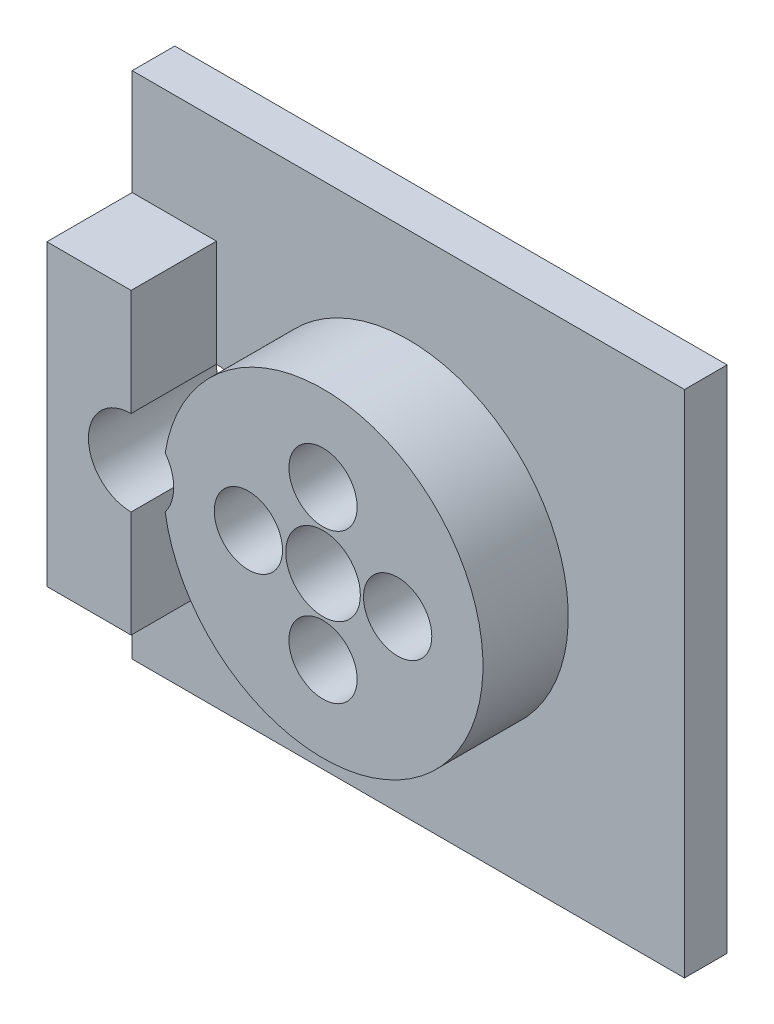
ISO-10303-21;
HEADER;
FILE_DESCRIPTION(('STEP AP214'),'2;1');
FILE_NAME('part.step','',(''),(''),'','','');
FILE_SCHEMA(('AUTOMOTIVE_DESIGN { 1 0 10303 214 1 1 1 1 }'));
ENDSEC;
DATA;
#1=APPLICATION_CONTEXT('core data for automotive mechanical design processes');
#2=APPLICATION_PROTOCOL_DEFINITION('international standard','automotive_design',2000,#1);
#3=PRODUCT_CONTEXT('',#1,'mechanical');
#4=PRODUCT('Part','Part','',(#3));
#5=PRODUCT_RELATED_PRODUCT_CATEGORY('part','',(#4));
#6=PRODUCT_DEFINITION_FORMATION('','',#4);
#7=PRODUCT_DEFINITION_CONTEXT('part definition',#1,'design');
#8=PRODUCT_DEFINITION('design','',#6,#7);
#9=PRODUCT_DEFINITION_SHAPE('','',#8);
#10=(LENGTH_UNIT() NAMED_UNIT(*) SI_UNIT(.MILLI.,.METRE.));
#11=(NAMED_UNIT(*) PLANE_ANGLE_UNIT() SI_UNIT($,.RADIAN.));
#12=(NAMED_UNIT(*) SI_UNIT($,.STERADIAN.) SOLID_ANGLE_UNIT());
#13=UNCERTAINTY_MEASURE_WITH_UNIT(LENGTH_MEASURE(1.E-05),#10,'distance_accuracy_value','');
#14=(GEOMETRIC_REPRESENTATION_CONTEXT(3) GLOBAL_UNCERTAINTY_ASSIGNED_CONTEXT((#13)) GLOBAL_UNIT_ASSIGNED_CONTEXT((#10,
#11,#12)) REPRESENTATION_CONTEXT('',''));
#15=CARTESIAN_POINT('',(0.,0.,0.));
#16=DIRECTION('',(0.,0.,1.));
#17=DIRECTION('',(1.,0.,0.));
#18=AXIS2_PLACEMENT_3D('',#15,#16,#17);
#19=CARTESIAN_POINT('',(0.,-7.,12.1));
#20=DIRECTION('',(0.,0.,-1.));
#21=DIRECTION('',(-1.,0.,0.));
#22=AXIS2_PLACEMENT_3D('',#19,#20,#21);
#23=CYLINDRICAL_SURFACE('',#22,1.7);
#24=CARTESIAN_POINT('',(0.,-7.,0.));
#25=DIRECTION('',(0.,0.,1.));
#26=DIRECTION('',(1.,0.,0.));
#27=AXIS2_PLACEMENT_3D('',#24,#25,#26);
#28=CIRCLE('',#27,1.7);
#29=CARTESIAN_POINT('',(1.7,-7.,0.));
#30=VERTEX_POINT('',#29);
#31=EDGE_CURVE('E218',#30,#30,#28,.F.);
#32=ORIENTED_EDGE('',*,*,#31,.T.);
#33=EDGE_LOOP('',(#32));
#34=FACE_BOUND('',#33,.T.);
#35=CARTESIAN_POINT('',(0.,-7.,5.));
#36=DIRECTION('',(0.,0.,1.));
#37=DIRECTION('',(1.,0.,0.));
#38=AXIS2_PLACEMENT_3D('',#35,#36,#37);
#39=CIRCLE('',#38,1.7);
#40=CARTESIAN_POINT('',(1.7,-7.,5.));
#41=VERTEX_POINT('',#40);
#42=EDGE_CURVE('E234',#41,#41,#39,.T.);
#43=ORIENTED_EDGE('',*,*,#42,.T.);
#44=EDGE_LOOP('',(#43));
#45=FACE_BOUND('',#44,.T.);
#46=ADVANCED_FACE('F39',(#34,#45),#23,.F.);
#47=CARTESIAN_POINT('',(-7.,0.,12.1));
#48=DIRECTION('',(0.,0.,-1.));
#49=DIRECTION('',(-1.,0.,0.));
#50=AXIS2_PLACEMENT_3D('',#47,#48,#49);
#51=CYLINDRICAL_SURFACE('',#50,1.7);
#52=CARTESIAN_POINT('',(-7.,0.,0.));
#53=DIRECTION('',(0.,0.,1.));
#54=DIRECTION('',(1.,0.,0.));
#55=AXIS2_PLACEMENT_3D('',#52,#53,#54);
#56=CIRCLE('',#55,1.7);
#57=CARTESIAN_POINT('',(-5.3,0.,0.));
#58=VERTEX_POINT('',#57);
#59=EDGE_CURVE('E262',#58,#58,#56,.F.);
#60=ORIENTED_EDGE('',*,*,#59,.T.);
#61=EDGE_LOOP('',(#60));
#62=FACE_BOUND('',#61,.T.);
#63=CARTESIAN_POINT('',(-7.,0.,5.));
#64=DIRECTION('',(0.,0.,1.));
#65=DIRECTION('',(1.,0.,0.));
#66=AXIS2_PLACEMENT_3D('',#63,#64,#65);
#67=CIRCLE('',#66,1.7);
#68=CARTESIAN_POINT('',(-5.3,0.,5.));
#69=VERTEX_POINT('',#68);
#70=EDGE_CURVE('E227',#69,#69,#67,.T.);
#71=ORIENTED_EDGE('',*,*,#70,.T.);
#72=EDGE_LOOP('',(#71));
#73=FACE_BOUND('',#72,.T.);
#74=ADVANCED_FACE('F337',(#62,#73),#51,.F.);
#75=CARTESIAN_POINT('',(0.,7.,12.1));
#76=DIRECTION('',(0.,0.,-1.));
#77=DIRECTION('',(-1.,0.,0.));
#78=AXIS2_PLACEMENT_3D('',#75,#76,#77);
#79=CYLINDRICAL_SURFACE('',#78,1.7);
#80=CARTESIAN_POINT('',(0.,7.,0.));
#81=DIRECTION('',(0.,0.,1.));
#82=DIRECTION('',(1.,0.,0.));
#83=AXIS2_PLACEMENT_3D('',#80,#81,#82);
#84=CIRCLE('',#83,1.7);
#85=CARTESIAN_POINT('',(1.7,7.,0.));
#86=VERTEX_POINT('',#85);
#87=EDGE_CURVE('E266',#86,#86,#84,.F.);
#88=ORIENTED_EDGE('',*,*,#87,.T.);
#89=EDGE_LOOP('',(#88));
#90=FACE_BOUND('',#89,.T.);
#91=CARTESIAN_POINT('',(0.,7.,5.));
#92=DIRECTION('',(0.,0.,1.));
#93=DIRECTION('',(1.,0.,0.));
#94=AXIS2_PLACEMENT_3D('',#91,#92,#93);
#95=CIRCLE('',#94,1.7);
#96=CARTESIAN_POINT('',(1.7,7.,5.));
#97=VERTEX_POINT('',#96);
#98=EDGE_CURVE('E219',#97,#97,#95,.T.);
#99=ORIENTED_EDGE('',*,*,#98,.T.);
#100=EDGE_LOOP('',(#99));
#101=FACE_BOUND('',#100,.T.);
#102=ADVANCED_FACE('F341',(#90,#101),#79,.F.);
#103=CARTESIAN_POINT('',(7.,0.,12.1));
#104=DIRECTION('',(0.,0.,-1.));
#105=DIRECTION('',(-1.,0.,0.));
#106=AXIS2_PLACEMENT_3D('',#103,#104,#105);
#107=CYLINDRICAL_SURFACE('',#106,1.7);
#108=CARTESIAN_POINT('',(7.,0.,0.));
#109=DIRECTION('',(0.,0.,1.));
#110=DIRECTION('',(1.,0.,0.));
#111=AXIS2_PLACEMENT_3D('',#108,#109,#110);
#112=CIRCLE('',#111,1.7);
#113=CARTESIAN_POINT('',(8.7,0.,0.));
#114=VERTEX_POINT('',#113);
#115=EDGE_CURVE('E212',#114,#114,#112,.F.);
#116=ORIENTED_EDGE('',*,*,#115,.T.);
#117=EDGE_LOOP('',(#116));
#118=FACE_BOUND('',#117,.T.);
#119=CARTESIAN_POINT('',(7.,0.,5.));
#120=DIRECTION('',(0.,0.,1.));
#121=DIRECTION('',(1.,0.,0.));
#122=AXIS2_PLACEMENT_3D('',#119,#120,#121);
#123=CIRCLE('',#122,1.7);
#124=CARTESIAN_POINT('',(8.7,0.,5.));
#125=VERTEX_POINT('',#124);
#126=EDGE_CURVE('E215',#125,#125,#123,.T.);
#127=ORIENTED_EDGE('',*,*,#126,.T.);
#128=EDGE_LOOP('',(#127));
#129=FACE_BOUND('',#128,.T.);
#130=ADVANCED_FACE('F353',(#118,#129),#107,.F.);
#131=CARTESIAN_POINT('',(0.,0.,12.));
#132=DIRECTION('',(0.,0.,-1.));
#133=DIRECTION('',(-1.,0.,0.));
#134=AXIS2_PLACEMENT_3D('',#131,#132,#133);
#135=CYLINDRICAL_SURFACE('',#134,15.);
#136=DIRECTION('',(0.,0.,-1.));
#137=VECTOR('',#136,1.);
#138=CARTESIAN_POINT('',(-14.8055555555556,2.40738960107375,6.));
#139=LINE('',#138,#137);
#140=CARTESIAN_POINT('',(-14.8055555555556,2.40738960107375,12.));
#141=VERTEX_POINT('',#140);
#142=CARTESIAN_POINT('',(-14.8055555555556,2.40738960107375,4.));
#143=VERTEX_POINT('',#142);
#144=EDGE_CURVE('E278',#141,#143,#139,.T.);
#145=ORIENTED_EDGE('',*,*,#144,.F.);
#146=CARTESIAN_POINT('',(0.,0.,12.));
#147=DIRECTION('',(0.,0.,1.));
#148=DIRECTION('',(1.,0.,0.));
#149=AXIS2_PLACEMENT_3D('',#146,#147,#148);
#150=CIRCLE('',#149,15.);
#151=CARTESIAN_POINT('',(-14.8055555555556,-2.40738960107376,12.));
#152=VERTEX_POINT('',#151);
#153=EDGE_CURVE('E161',#152,#141,#150,.T.);
#154=ORIENTED_EDGE('',*,*,#153,.F.);
#155=DIRECTION('',(0.,0.,-1.));
#156=VECTOR('',#155,1.);
#157=CARTESIAN_POINT('',(-14.8055555555556,-2.40738960107375,6.));
#158=LINE('',#157,#156);
#159=CARTESIAN_POINT('',(-14.8055555555556,-2.40738960107375,4.));
#160=VERTEX_POINT('',#159);
#161=EDGE_CURVE('E279',#160,#152,#158,.F.);
#162=ORIENTED_EDGE('',*,*,#161,.F.);
#163=CARTESIAN_POINT('',(0.,0.,4.));
#164=DIRECTION('',(0.,0.,1.));
#165=DIRECTION('',(1.,0.,0.));
#166=AXIS2_PLACEMENT_3D('',#163,#164,#165);
#167=CIRCLE('',#166,15.);
#168=EDGE_CURVE('E168',#143,#160,#167,.F.);
#169=ORIENTED_EDGE('',*,*,#168,.F.);
#170=EDGE_LOOP('',(#145,#154,#162,#169));
#171=FACE_BOUND('',#170,.T.);
#172=ADVANCED_FACE('F304',(#171),#135,.T.);
#173=CARTESIAN_POINT('',(-18.,-14.,12.));
#174=DIRECTION('',(-1.,0.,0.));
#175=DIRECTION('',(0.,0.,1.));
#176=AXIS2_PLACEMENT_3D('',#173,#174,#175);
#177=PLANE('',#176);
#178=DIRECTION('',(0.,0.,-1.));
#179=VECTOR('',#178,1.);
#180=CARTESIAN_POINT('',(-18.,4.,12.1));
#181=LINE('',#180,#179);
#182=CARTESIAN_POINT('',(-18.,4.,4.));
#183=VERTEX_POINT('',#182);
#184=CARTESIAN_POINT('',(-18.,4.,12.));
#185=VERTEX_POINT('',#184);
#186=EDGE_CURVE('E57',#183,#185,#181,.F.);
#187=ORIENTED_EDGE('',*,*,#186,.F.);
#188=DIRECTION('',(0.,-1.,0.));
#189=VECTOR('',#188,1.);
#190=CARTESIAN_POINT('',(-18.,0.,4.));
#191=LINE('',#190,#189);
#192=CARTESIAN_POINT('',(-18.,14.,4.));
#193=VERTEX_POINT('',#192);
#194=EDGE_CURVE('E204',#193,#183,#191,.T.);
#195=ORIENTED_EDGE('',*,*,#194,.F.);
#196=DIRECTION('',(0.,0.,-1.));
#197=VECTOR('',#196,1.);
#198=CARTESIAN_POINT('',(-18.,14.,12.));
#199=LINE('',#198,#197);
#200=CARTESIAN_POINT('',(-18.,14.,12.));
#201=VERTEX_POINT('',#200);
#202=EDGE_CURVE('E64',#201,#193,#199,.T.);
#203=ORIENTED_EDGE('',*,*,#202,.F.);
#204=DIRECTION('',(0.,1.,0.));
#205=VECTOR('',#204,1.);
#206=CARTESIAN_POINT('',(-18.,-14.,12.));
#207=LINE('',#206,#205);
#208=EDGE_CURVE('E146',#185,#201,#207,.T.);
#209=ORIENTED_EDGE('',*,*,#208,.F.);
#210=EDGE_LOOP('',(#187,#195,#203,#209));
#211=FACE_BOUND('',#210,.T.);
#212=ADVANCED_FACE('F307',(#211),#177,.F.);
#213=DIRECTION('',(0.,0.,-1.));
#214=VECTOR('',#213,1.);
#215=CARTESIAN_POINT('',(-18.,-4.,12.1));
#216=LINE('',#215,#214);
#217=CARTESIAN_POINT('',(-18.,-4.,12.));
#218=VERTEX_POINT('',#217);
#219=CARTESIAN_POINT('',(-18.,-4.,4.));
#220=VERTEX_POINT('',#219);
#221=EDGE_CURVE('E128',#218,#220,#216,.T.);
#222=ORIENTED_EDGE('',*,*,#221,.F.);
#223=CARTESIAN_POINT('',(-18.,-14.,12.));
#224=VERTEX_POINT('',#223);
#225=EDGE_CURVE('E140',#224,#218,#207,.T.);
#226=ORIENTED_EDGE('',*,*,#225,.F.);
#227=DIRECTION('',(0.,0.,-1.));
#228=VECTOR('',#227,1.);
#229=CARTESIAN_POINT('',(-18.,-14.,12.));
#230=LINE('',#229,#228);
#231=CARTESIAN_POINT('',(-18.,-14.,4.));
#232=VERTEX_POINT('',#231);
#233=EDGE_CURVE('E158',#224,#232,#230,.T.);
#234=ORIENTED_EDGE('',*,*,#233,.T.);
#235=EDGE_CURVE('E142',#220,#232,#191,.T.);
#236=ORIENTED_EDGE('',*,*,#235,.F.);
#237=EDGE_LOOP('',(#222,#226,#234,#236));
#238=FACE_BOUND('',#237,.T.);
#239=ADVANCED_FACE('F139',(#238),#177,.F.);
#240=CARTESIAN_POINT('',(0.,0.,4.));
#241=DIRECTION('',(0.,0.,1.));
#242=DIRECTION('',(1.,0.,0.));
#243=AXIS2_PLACEMENT_3D('',#240,#241,#242);
#244=PLANE('',#243);
#245=ORIENTED_EDGE('',*,*,#168,.T.);
#246=CARTESIAN_POINT('',(-18.,0.,4.));
#247=DIRECTION('',(0.,0.,1.));
#248=DIRECTION('',(1.,0.,0.));
#249=AXIS2_PLACEMENT_3D('',#246,#247,#248);
#250=CIRCLE('',#249,4.);
#251=EDGE_CURVE('E280',#160,#220,#250,.F.);
#252=ORIENTED_EDGE('',*,*,#251,.T.);
#253=ORIENTED_EDGE('',*,*,#235,.T.);
#254=DIRECTION('',(-1.,0.,0.));
#255=VECTOR('',#254,1.);
#256=CARTESIAN_POINT('',(0.,-14.,4.));
#257=LINE('',#256,#255);
#258=CARTESIAN_POINT('',(-25.9,-14.,4.));
#259=VERTEX_POINT('',#258);
#260=EDGE_CURVE('E48',#232,#259,#257,.T.);
#261=ORIENTED_EDGE('',*,*,#260,.T.);
#262=DIRECTION('',(0.,-1.,0.));
#263=VECTOR('',#262,1.);
#264=CARTESIAN_POINT('',(-25.9,23.9,4.));
#265=LINE('',#264,#263);
#266=CARTESIAN_POINT('',(-25.9,-23.9,4.));
#267=VERTEX_POINT('',#266);
#268=EDGE_CURVE('E171',#259,#267,#265,.T.);
#269=ORIENTED_EDGE('',*,*,#268,.T.);
#270=DIRECTION('',(1.,0.,0.));
#271=VECTOR('',#270,1.);
#272=CARTESIAN_POINT('',(-25.9,-23.9,4.));
#273=LINE('',#272,#271);
#274=CARTESIAN_POINT('',(25.9,-23.9,4.));
#275=VERTEX_POINT('',#274);
#276=EDGE_CURVE('E167',#267,#275,#273,.T.);
#277=ORIENTED_EDGE('',*,*,#276,.T.);
#278=DIRECTION('',(0.,1.,0.));
#279=VECTOR('',#278,1.);
#280=CARTESIAN_POINT('',(25.9,-23.9,4.));
#281=LINE('',#280,#279);
#282=CARTESIAN_POINT('',(25.9,23.9,4.));
#283=VERTEX_POINT('',#282);
#284=EDGE_CURVE('E173',#275,#283,#281,.T.);
#285=ORIENTED_EDGE('',*,*,#284,.T.);
#286=DIRECTION('',(-1.,0.,0.));
#287=VECTOR('',#286,1.);
#288=CARTESIAN_POINT('',(25.9,23.9,4.));
#289=LINE('',#288,#287);
#290=CARTESIAN_POINT('',(-25.9,23.9,4.));
#291=VERTEX_POINT('',#290);
#292=EDGE_CURVE('E174',#283,#291,#289,.T.);
#293=ORIENTED_EDGE('',*,*,#292,.T.);
#294=CARTESIAN_POINT('',(-25.9,14.,4.));
#295=VERTEX_POINT('',#294);
#296=EDGE_CURVE('E170',#291,#295,#265,.T.);
#297=ORIENTED_EDGE('',*,*,#296,.T.);
#298=DIRECTION('',(1.,0.,0.));
#299=VECTOR('',#298,1.);
#300=CARTESIAN_POINT('',(0.,14.,4.));
#301=LINE('',#300,#299);
#302=EDGE_CURVE('E197',#295,#193,#301,.T.);
#303=ORIENTED_EDGE('',*,*,#302,.T.);
#304=ORIENTED_EDGE('',*,*,#194,.T.);
#305=EDGE_CURVE('E274',#183,#143,#250,.F.);
#306=ORIENTED_EDGE('',*,*,#305,.T.);
#307=EDGE_LOOP('',(#245,#252,#253,#261,#269,#277,#285,#293,#297,#303,#304,#306));
#308=FACE_BOUND('',#307,.T.);
#309=ADVANCED_FACE('F296',(#308),#244,.T.);
#310=CARTESIAN_POINT('',(-25.9,23.9,4.));
#311=DIRECTION('',(1.,0.,0.));
#312=DIRECTION('',(0.,0.,-1.));
#313=AXIS2_PLACEMENT_3D('',#310,#311,#312);
#314=PLANE('',#313);
#315=CARTESIAN_POINT('',(-25.9,10.,8.));
#316=DIRECTION('',(1.,0.,0.));
#317=DIRECTION('',(0.,0.,-1.));
#318=AXIS2_PLACEMENT_3D('',#315,#316,#317);
#319=CIRCLE('',#318,0.9);
#320=CARTESIAN_POINT('',(-25.9,10.,7.1));
#321=VERTEX_POINT('',#320);
#322=EDGE_CURVE('E43',#321,#321,#319,.F.);
#323=ORIENTED_EDGE('',*,*,#322,.F.);
#324=EDGE_LOOP('',(#323));
#325=FACE_BOUND('',#324,.T.);
#326=CARTESIAN_POINT('',(-25.9,-10.,8.));
#327=DIRECTION('',(1.,0.,0.));
#328=DIRECTION('',(0.,0.,-1.));
#329=AXIS2_PLACEMENT_3D('',#326,#327,#328);
#330=CIRCLE('',#329,0.9);
#331=CARTESIAN_POINT('',(-25.9,-10.,7.1));
#332=VERTEX_POINT('',#331);
#333=EDGE_CURVE('E239',#332,#332,#330,.F.);
#334=ORIENTED_EDGE('',*,*,#333,.F.);
#335=EDGE_LOOP('',(#334));
#336=FACE_BOUND('',#335,.T.);
#337=ORIENTED_EDGE('',*,*,#268,.F.);
#338=DIRECTION('',(0.,0.,-1.));
#339=VECTOR('',#338,1.);
#340=CARTESIAN_POINT('',(-25.9,-14.,12.));
#341=LINE('',#340,#339);
#342=CARTESIAN_POINT('',(-25.9,-14.,12.));
#343=VERTEX_POINT('',#342);
#344=EDGE_CURVE('E163',#343,#259,#341,.T.);
#345=ORIENTED_EDGE('',*,*,#344,.F.);
#346=DIRECTION('',(0.,-1.,0.));
#347=VECTOR('',#346,1.);
#348=CARTESIAN_POINT('',(-25.9,14.,12.));
#349=LINE('',#348,#347);
#350=CARTESIAN_POINT('',(-25.9,14.,12.));
#351=VERTEX_POINT('',#350);
#352=EDGE_CURVE('E287',#351,#343,#349,.T.);
#353=ORIENTED_EDGE('',*,*,#352,.F.);
#354=DIRECTION('',(0.,0.,-1.));
#355=VECTOR('',#354,1.);
#356=CARTESIAN_POINT('',(-25.9,14.,12.));
#357=LINE('',#356,#355);
#358=EDGE_CURVE('E151',#351,#295,#357,.T.);
#359=ORIENTED_EDGE('',*,*,#358,.T.);
#360=ORIENTED_EDGE('',*,*,#296,.F.);
#361=DIRECTION('',(0.,0.,-1.));
#362=VECTOR('',#361,1.);
#363=CARTESIAN_POINT('',(-25.9,23.9,4.));
#364=LINE('',#363,#362);
#365=CARTESIAN_POINT('',(-25.9,23.9,0.));
#366=VERTEX_POINT('',#365);
#367=EDGE_CURVE('E180',#291,#366,#364,.T.);
#368=ORIENTED_EDGE('',*,*,#367,.T.);
#369=DIRECTION('',(0.,-1.,0.));
#370=VECTOR('',#369,1.);
#371=CARTESIAN_POINT('',(-25.9,23.9,0.));
#372=LINE('',#371,#370);
#373=CARTESIAN_POINT('',(-25.9,-23.9,0.));
#374=VERTEX_POINT('',#373);
#375=EDGE_CURVE('E178',#366,#374,#372,.T.);
#376=ORIENTED_EDGE('',*,*,#375,.T.);
#377=DIRECTION('',(0.,0.,-1.));
#378=VECTOR('',#377,1.);
#379=CARTESIAN_POINT('',(-25.9,-23.9,4.));
#380=LINE('',#379,#378);
#381=EDGE_CURVE('E193',#267,#374,#380,.T.);
#382=ORIENTED_EDGE('',*,*,#381,.F.);
#383=EDGE_LOOP('',(#337,#345,#353,#359,#360,#368,#376,#382));
#384=FACE_BOUND('',#383,.T.);
#385=ADVANCED_FACE('F41',(#325,#336,#384),#314,.F.);
#386=CARTESIAN_POINT('',(-25.9,-23.9,4.));
#387=DIRECTION('',(0.,1.,0.));
#388=DIRECTION('',(0.,0.,1.));
#389=AXIS2_PLACEMENT_3D('',#386,#387,#388);
#390=PLANE('',#389);
#391=DIRECTION('',(1.,0.,0.));
#392=VECTOR('',#391,1.);
#393=CARTESIAN_POINT('',(-25.9,-23.9,0.));
#394=LINE('',#393,#392);
#395=CARTESIAN_POINT('',(25.9,-23.9,0.));
#396=VERTEX_POINT('',#395);
#397=EDGE_CURVE('E181',#374,#396,#394,.T.);
#398=ORIENTED_EDGE('',*,*,#397,.T.);
#399=DIRECTION('',(0.,0.,-1.));
#400=VECTOR('',#399,1.);
#401=CARTESIAN_POINT('',(25.9,-23.9,4.));
#402=LINE('',#401,#400);
#403=EDGE_CURVE('E195',#275,#396,#402,.T.);
#404=ORIENTED_EDGE('',*,*,#403,.F.);
#405=ORIENTED_EDGE('',*,*,#276,.F.);
#406=ORIENTED_EDGE('',*,*,#381,.T.);
#407=EDGE_LOOP('',(#398,#404,#405,#406));
#408=FACE_BOUND('',#407,.T.);
#409=ADVANCED_FACE('F323',(#408),#390,.F.);
#410=CARTESIAN_POINT('',(25.9,-23.9,4.));
#411=DIRECTION('',(-1.,0.,0.));
#412=DIRECTION('',(0.,0.,1.));
#413=AXIS2_PLACEMENT_3D('',#410,#411,#412);
#414=PLANE('',#413);
#415=DIRECTION('',(0.,1.,0.));
#416=VECTOR('',#415,1.);
#417=CARTESIAN_POINT('',(25.9,-23.9,0.));
#418=LINE('',#417,#416);
#419=CARTESIAN_POINT('',(25.9,23.9,0.));
#420=VERTEX_POINT('',#419);
#421=EDGE_CURVE('E182',#396,#420,#418,.T.);
#422=ORIENTED_EDGE('',*,*,#421,.T.);
#423=DIRECTION('',(0.,0.,-1.));
#424=VECTOR('',#423,1.);
#425=CARTESIAN_POINT('',(25.9,23.9,4.));
#426=LINE('',#425,#424);
#427=EDGE_CURVE('E186',#283,#420,#426,.T.);
#428=ORIENTED_EDGE('',*,*,#427,.F.);
#429=ORIENTED_EDGE('',*,*,#284,.F.);
#430=ORIENTED_EDGE('',*,*,#403,.T.);
#431=EDGE_LOOP('',(#422,#428,#429,#430));
#432=FACE_BOUND('',#431,.T.);
#433=ADVANCED_FACE('F330',(#432),#414,.F.);
#434=CARTESIAN_POINT('',(25.9,23.9,4.));
#435=DIRECTION('',(0.,-1.,0.));
#436=DIRECTION('',(0.,0.,-1.));
#437=AXIS2_PLACEMENT_3D('',#434,#435,#436);
#438=PLANE('',#437);
#439=DIRECTION('',(-1.,0.,0.));
#440=VECTOR('',#439,1.);
#441=CARTESIAN_POINT('',(25.9,23.9,0.));
#442=LINE('',#441,#440);
#443=EDGE_CURVE('E184',#420,#366,#442,.T.);
#444=ORIENTED_EDGE('',*,*,#443,.T.);
#445=ORIENTED_EDGE('',*,*,#367,.F.);
#446=ORIENTED_EDGE('',*,*,#292,.F.);
#447=ORIENTED_EDGE('',*,*,#427,.T.);
#448=EDGE_LOOP('',(#444,#445,#446,#447));
#449=FACE_BOUND('',#448,.T.);
#450=ADVANCED_FACE('F320',(#449),#438,.F.);
#451=CARTESIAN_POINT('',(0.,0.,0.));
#452=DIRECTION('',(0.,0.,1.));
#453=DIRECTION('',(1.,0.,0.));
#454=AXIS2_PLACEMENT_3D('',#451,#452,#453);
#455=PLANE('',#454);
#456=ORIENTED_EDGE('',*,*,#31,.F.);
#457=EDGE_LOOP('',(#456));
#458=FACE_BOUND('',#457,.T.);
#459=ORIENTED_EDGE('',*,*,#59,.F.);
#460=EDGE_LOOP('',(#459));
#461=FACE_BOUND('',#460,.T.);
#462=ORIENTED_EDGE('',*,*,#87,.F.);
#463=EDGE_LOOP('',(#462));
#464=FACE_BOUND('',#463,.T.);
#465=ORIENTED_EDGE('',*,*,#115,.F.);
#466=EDGE_LOOP('',(#465));
#467=FACE_BOUND('',#466,.T.);
#468=CARTESIAN_POINT('',(0.,0.,0.));
#469=DIRECTION('',(0.,0.,1.));
#470=DIRECTION('',(1.,0.,0.));
#471=AXIS2_PLACEMENT_3D('',#468,#469,#470);
#472=CIRCLE('',#471,3.5);
#473=CARTESIAN_POINT('',(3.5,0.,0.));
#474=VERTEX_POINT('',#473);
#475=EDGE_CURVE('E145',#474,#474,#472,.F.);
#476=ORIENTED_EDGE('',*,*,#475,.F.);
#477=EDGE_LOOP('',(#476));
#478=FACE_BOUND('',#477,.T.);
#479=CARTESIAN_POINT('',(-18.,0.,0.));
#480=DIRECTION('',(0.,0.,1.));
#481=DIRECTION('',(1.,0.,0.));
#482=AXIS2_PLACEMENT_3D('',#479,#480,#481);
#483=CIRCLE('',#482,4.);
#484=CARTESIAN_POINT('',(-14.,0.,0.));
#485=VERTEX_POINT('',#484);
#486=EDGE_CURVE('E284',#485,#485,#483,.F.);
#487=ORIENTED_EDGE('',*,*,#486,.F.);
#488=EDGE_LOOP('',(#487));
#489=FACE_BOUND('',#488,.T.);
#490=ORIENTED_EDGE('',*,*,#375,.F.);
#491=ORIENTED_EDGE('',*,*,#443,.F.);
#492=ORIENTED_EDGE('',*,*,#421,.F.);
#493=ORIENTED_EDGE('',*,*,#397,.F.);
#494=EDGE_LOOP('',(#490,#491,#492,#493));
#495=FACE_BOUND('',#494,.T.);
#496=ADVANCED_FACE('F322',(#458,#461,#464,#467,#478,#489,#495),#455,.F.);
#497=CARTESIAN_POINT('',(0.,0.,12.));
#498=DIRECTION('',(0.,0.,1.));
#499=DIRECTION('',(1.,0.,0.));
#500=AXIS2_PLACEMENT_3D('',#497,#498,#499);
#501=PLANE('',#500);
#502=CARTESIAN_POINT('',(0.,-7.,12.));
#503=DIRECTION('',(0.,0.,1.));
#504=DIRECTION('',(1.,0.,0.));
#505=AXIS2_PLACEMENT_3D('',#502,#503,#504);
#506=CIRCLE('',#505,3.2);
#507=CARTESIAN_POINT('',(3.2,-7.,12.));
#508=VERTEX_POINT('',#507);
#509=EDGE_CURVE('E240',#508,#508,#506,.F.);
#510=ORIENTED_EDGE('',*,*,#509,.T.);
#511=EDGE_LOOP('',(#510));
#512=FACE_BOUND('',#511,.T.);
#513=CARTESIAN_POINT('',(-7.,0.,12.));
#514=DIRECTION('',(0.,0.,1.));
#515=DIRECTION('',(1.,0.,0.));
#516=AXIS2_PLACEMENT_3D('',#513,#514,#515);
#517=CIRCLE('',#516,3.2);
#518=CARTESIAN_POINT('',(-3.8,0.,12.));
#519=VERTEX_POINT('',#518);
#520=EDGE_CURVE('E229',#519,#519,#517,.F.);
#521=ORIENTED_EDGE('',*,*,#520,.T.);
#522=EDGE_LOOP('',(#521));
#523=FACE_BOUND('',#522,.T.);
#524=CARTESIAN_POINT('',(0.,7.,12.));
#525=DIRECTION('',(0.,0.,1.));
#526=DIRECTION('',(1.,0.,0.));
#527=AXIS2_PLACEMENT_3D('',#524,#525,#526);
#528=CIRCLE('',#527,3.2);
#529=CARTESIAN_POINT('',(3.2,7.,12.));
#530=VERTEX_POINT('',#529);
#531=EDGE_CURVE('E224',#530,#530,#528,.F.);
#532=ORIENTED_EDGE('',*,*,#531,.T.);
#533=EDGE_LOOP('',(#532));
#534=FACE_BOUND('',#533,.T.);
#535=CARTESIAN_POINT('',(7.,0.,12.));
#536=DIRECTION('',(0.,0.,1.));
#537=DIRECTION('',(1.,0.,0.));
#538=AXIS2_PLACEMENT_3D('',#535,#536,#537);
#539=CIRCLE('',#538,3.2);
#540=CARTESIAN_POINT('',(10.2,0.,12.));
#541=VERTEX_POINT('',#540);
#542=EDGE_CURVE('E213',#541,#541,#539,.F.);
#543=ORIENTED_EDGE('',*,*,#542,.T.);
#544=EDGE_LOOP('',(#543));
#545=FACE_BOUND('',#544,.T.);
#546=CARTESIAN_POINT('',(0.,0.,12.));
#547=DIRECTION('',(0.,0.,1.));
#548=DIRECTION('',(1.,0.,0.));
#549=AXIS2_PLACEMENT_3D('',#546,#547,#548);
#550=CIRCLE('',#549,3.5);
#551=CARTESIAN_POINT('',(3.5,0.,12.));
#552=VERTEX_POINT('',#551);
#553=EDGE_CURVE('E206',#552,#552,#550,.F.);
#554=ORIENTED_EDGE('',*,*,#553,.T.);
#555=EDGE_LOOP('',(#554));
#556=FACE_BOUND('',#555,.T.);
#557=ORIENTED_EDGE('',*,*,#153,.T.);
#558=CARTESIAN_POINT('',(-18.,0.,12.));
#559=DIRECTION('',(0.,0.,1.));
#560=DIRECTION('',(1.,0.,0.));
#561=AXIS2_PLACEMENT_3D('',#558,#559,#560);
#562=CIRCLE('',#561,4.);
#563=EDGE_CURVE('E285',#141,#152,#562,.F.);
#564=ORIENTED_EDGE('',*,*,#563,.T.);
#565=EDGE_LOOP('',(#557,#564));
#566=FACE_BOUND('',#565,.T.);
#567=ADVANCED_FACE('F310',(#512,#523,#534,#545,#556,#566),#501,.T.);
#568=CARTESIAN_POINT('',(-25.9,-14.,12.));
#569=DIRECTION('',(0.,1.,0.));
#570=DIRECTION('',(0.,0.,1.));
#571=AXIS2_PLACEMENT_3D('',#568,#569,#570);
#572=PLANE('',#571);
#573=ORIENTED_EDGE('',*,*,#260,.F.);
#574=ORIENTED_EDGE('',*,*,#233,.F.);
#575=DIRECTION('',(1.,0.,0.));
#576=VECTOR('',#575,1.);
#577=CARTESIAN_POINT('',(-25.9,-14.,12.));
#578=LINE('',#577,#576);
#579=EDGE_CURVE('E147',#343,#224,#578,.T.);
#580=ORIENTED_EDGE('',*,*,#579,.F.);
#581=ORIENTED_EDGE('',*,*,#344,.T.);
#582=EDGE_LOOP('',(#573,#574,#580,#581));
#583=FACE_BOUND('',#582,.T.);
#584=ADVANCED_FACE('F298',(#583),#572,.F.);
#585=CARTESIAN_POINT('',(-18.,14.,12.));
#586=DIRECTION('',(0.,-1.,0.));
#587=DIRECTION('',(0.,0.,-1.));
#588=AXIS2_PLACEMENT_3D('',#585,#586,#587);
#589=PLANE('',#588);
#590=ORIENTED_EDGE('',*,*,#302,.F.);
#591=ORIENTED_EDGE('',*,*,#358,.F.);
#592=DIRECTION('',(-1.,0.,0.));
#593=VECTOR('',#592,1.);
#594=CARTESIAN_POINT('',(-18.,14.,12.));
#595=LINE('',#594,#593);
#596=EDGE_CURVE('E149',#201,#351,#595,.T.);
#597=ORIENTED_EDGE('',*,*,#596,.F.);
#598=ORIENTED_EDGE('',*,*,#202,.T.);
#599=EDGE_LOOP('',(#590,#591,#597,#598));
#600=FACE_BOUND('',#599,.T.);
#601=ADVANCED_FACE('F309',(#600),#589,.F.);
#602=CARTESIAN_POINT('',(0.,0.,12.));
#603=DIRECTION('',(0.,0.,1.));
#604=DIRECTION('',(1.,0.,0.));
#605=AXIS2_PLACEMENT_3D('',#602,#603,#604);
#606=PLANE('',#605);
#607=ORIENTED_EDGE('',*,*,#225,.T.);
#608=CARTESIAN_POINT('',(-18.,0.,12.));
#609=DIRECTION('',(0.,0.,1.));
#610=DIRECTION('',(1.,0.,0.));
#611=AXIS2_PLACEMENT_3D('',#608,#609,#610);
#612=CIRCLE('',#611,4.);
#613=EDGE_CURVE('E11',#218,#185,#612,.F.);
#614=ORIENTED_EDGE('',*,*,#613,.T.);
#615=ORIENTED_EDGE('',*,*,#208,.T.);
#616=ORIENTED_EDGE('',*,*,#596,.T.);
#617=ORIENTED_EDGE('',*,*,#352,.T.);
#618=ORIENTED_EDGE('',*,*,#579,.T.);
#619=EDGE_LOOP('',(#607,#614,#615,#616,#617,#618));
#620=FACE_BOUND('',#619,.T.);
#621=ADVANCED_FACE('F144',(#620),#606,.T.);
#622=CARTESIAN_POINT('',(-18.,0.,12.1));
#623=DIRECTION('',(0.,0.,-1.));
#624=DIRECTION('',(-1.,0.,0.));
#625=AXIS2_PLACEMENT_3D('',#622,#623,#624);
#626=CYLINDRICAL_SURFACE('',#625,4.);
#627=ORIENTED_EDGE('',*,*,#144,.T.);
#628=ORIENTED_EDGE('',*,*,#305,.F.);
#629=ORIENTED_EDGE('',*,*,#186,.T.);
#630=ORIENTED_EDGE('',*,*,#613,.F.);
#631=ORIENTED_EDGE('',*,*,#221,.T.);
#632=ORIENTED_EDGE('',*,*,#251,.F.);
#633=ORIENTED_EDGE('',*,*,#161,.T.);
#634=ORIENTED_EDGE('',*,*,#563,.F.);
#635=EDGE_LOOP('',(#627,#628,#629,#630,#631,#632,#633,#634));
#636=FACE_BOUND('',#635,.T.);
#637=ORIENTED_EDGE('',*,*,#486,.T.);
#638=EDGE_LOOP('',(#637));
#639=FACE_BOUND('',#638,.T.);
#640=ADVANCED_FACE('F129',(#636,#639),#626,.F.);
#641=CARTESIAN_POINT('',(0.,0.,12.1));
#642=DIRECTION('',(0.,0.,-1.));
#643=DIRECTION('',(-1.,0.,0.));
#644=AXIS2_PLACEMENT_3D('',#641,#642,#643);
#645=CYLINDRICAL_SURFACE('',#644,3.5);
#646=ORIENTED_EDGE('',*,*,#553,.F.);
#647=EDGE_LOOP('',(#646));
#648=FACE_BOUND('',#647,.T.);
#649=ORIENTED_EDGE('',*,*,#475,.T.);
#650=EDGE_LOOP('',(#649));
#651=FACE_BOUND('',#650,.T.);
#652=ADVANCED_FACE('F360',(#648,#651),#645,.F.);
#653=CARTESIAN_POINT('',(7.,0.,12.1));
#654=DIRECTION('',(0.,0.,-1.));
#655=DIRECTION('',(-1.,0.,0.));
#656=AXIS2_PLACEMENT_3D('',#653,#654,#655);
#657=CYLINDRICAL_SURFACE('',#656,3.2);
#658=ORIENTED_EDGE('',*,*,#542,.F.);
#659=EDGE_LOOP('',(#658));
#660=FACE_BOUND('',#659,.T.);
#661=CARTESIAN_POINT('',(7.,0.,5.));
#662=DIRECTION('',(0.,0.,1.));
#663=DIRECTION('',(1.,0.,0.));
#664=AXIS2_PLACEMENT_3D('',#661,#662,#663);
#665=CIRCLE('',#664,3.2);
#666=CARTESIAN_POINT('',(10.2,0.,5.));
#667=VERTEX_POINT('',#666);
#668=EDGE_CURVE('E216',#667,#667,#665,.T.);
#669=ORIENTED_EDGE('',*,*,#668,.F.);
#670=EDGE_LOOP('',(#669));
#671=FACE_BOUND('',#670,.T.);
#672=ADVANCED_FACE('F348',(#660,#671),#657,.F.);
#673=CARTESIAN_POINT('',(7.,0.,5.));
#674=DIRECTION('',(0.,0.,1.));
#675=DIRECTION('',(1.,0.,0.));
#676=AXIS2_PLACEMENT_3D('',#673,#674,#675);
#677=PLANE('',#676);
#678=ORIENTED_EDGE('',*,*,#126,.F.);
#679=EDGE_LOOP('',(#678));
#680=FACE_BOUND('',#679,.T.);
#681=ORIENTED_EDGE('',*,*,#668,.T.);
#682=EDGE_LOOP('',(#681));
#683=FACE_BOUND('',#682,.T.);
#684=ADVANCED_FACE('F399',(#680,#683),#677,.T.);
#685=CARTESIAN_POINT('',(0.,7.,12.1));
#686=DIRECTION('',(0.,0.,-1.));
#687=DIRECTION('',(-1.,0.,0.));
#688=AXIS2_PLACEMENT_3D('',#685,#686,#687);
#689=CYLINDRICAL_SURFACE('',#688,3.2);
#690=ORIENTED_EDGE('',*,*,#531,.F.);
#691=EDGE_LOOP('',(#690));
#692=FACE_BOUND('',#691,.T.);
#693=CARTESIAN_POINT('',(0.,7.,5.));
#694=DIRECTION('',(0.,0.,1.));
#695=DIRECTION('',(1.,0.,0.));
#696=AXIS2_PLACEMENT_3D('',#693,#694,#695);
#697=CIRCLE('',#696,3.2);
#698=CARTESIAN_POINT('',(3.2,7.,5.));
#699=VERTEX_POINT('',#698);
#700=EDGE_CURVE('E223',#699,#699,#697,.T.);
#701=ORIENTED_EDGE('',*,*,#700,.F.);
#702=EDGE_LOOP('',(#701));
#703=FACE_BOUND('',#702,.T.);
#704=ADVANCED_FACE('F402',(#692,#703),#689,.F.);
#705=CARTESIAN_POINT('',(0.,7.,5.));
#706=DIRECTION('',(0.,0.,1.));
#707=DIRECTION('',(1.,0.,0.));
#708=AXIS2_PLACEMENT_3D('',#705,#706,#707);
#709=PLANE('',#708);
#710=ORIENTED_EDGE('',*,*,#98,.F.);
#711=EDGE_LOOP('',(#710));
#712=FACE_BOUND('',#711,.T.);
#713=ORIENTED_EDGE('',*,*,#700,.T.);
#714=EDGE_LOOP('',(#713));
#715=FACE_BOUND('',#714,.T.);
#716=ADVANCED_FACE('F435',(#712,#715),#709,.T.);
#717=CARTESIAN_POINT('',(-7.,0.,12.1));
#718=DIRECTION('',(0.,0.,-1.));
#719=DIRECTION('',(-1.,0.,0.));
#720=AXIS2_PLACEMENT_3D('',#717,#718,#719);
#721=CYLINDRICAL_SURFACE('',#720,3.2);
#722=ORIENTED_EDGE('',*,*,#520,.F.);
#723=EDGE_LOOP('',(#722));
#724=FACE_BOUND('',#723,.T.);
#725=CARTESIAN_POINT('',(-7.,0.,5.));
#726=DIRECTION('',(0.,0.,1.));
#727=DIRECTION('',(1.,0.,0.));
#728=AXIS2_PLACEMENT_3D('',#725,#726,#727);
#729=CIRCLE('',#728,3.2);
#730=CARTESIAN_POINT('',(-3.8,0.,5.));
#731=VERTEX_POINT('',#730);
#732=EDGE_CURVE('E233',#731,#731,#729,.T.);
#733=ORIENTED_EDGE('',*,*,#732,.F.);
#734=EDGE_LOOP('',(#733));
#735=FACE_BOUND('',#734,.T.);
#736=ADVANCED_FACE('F437',(#724,#735),#721,.F.);
#737=CARTESIAN_POINT('',(-7.,0.,5.));
#738=DIRECTION('',(0.,0.,1.));
#739=DIRECTION('',(1.,0.,0.));
#740=AXIS2_PLACEMENT_3D('',#737,#738,#739);
#741=PLANE('',#740);
#742=ORIENTED_EDGE('',*,*,#70,.F.);
#743=EDGE_LOOP('',(#742));
#744=FACE_BOUND('',#743,.T.);
#745=ORIENTED_EDGE('',*,*,#732,.T.);
#746=EDGE_LOOP('',(#745));
#747=FACE_BOUND('',#746,.T.);
#748=ADVANCED_FACE('F454',(#744,#747),#741,.T.);
#749=CARTESIAN_POINT('',(0.,-7.,12.1));
#750=DIRECTION('',(0.,0.,-1.));
#751=DIRECTION('',(-1.,0.,0.));
#752=AXIS2_PLACEMENT_3D('',#749,#750,#751);
#753=CYLINDRICAL_SURFACE('',#752,3.2);
#754=ORIENTED_EDGE('',*,*,#509,.F.);
#755=EDGE_LOOP('',(#754));
#756=FACE_BOUND('',#755,.T.);
#757=CARTESIAN_POINT('',(0.,-7.,5.));
#758=DIRECTION('',(0.,0.,1.));
#759=DIRECTION('',(1.,0.,0.));
#760=AXIS2_PLACEMENT_3D('',#757,#758,#759);
#761=CIRCLE('',#760,3.2);
#762=CARTESIAN_POINT('',(3.2,-7.,5.));
#763=VERTEX_POINT('',#762);
#764=EDGE_CURVE('E238',#763,#763,#761,.T.);
#765=ORIENTED_EDGE('',*,*,#764,.F.);
#766=EDGE_LOOP('',(#765));
#767=FACE_BOUND('',#766,.T.);
#768=ADVANCED_FACE('F459',(#756,#767),#753,.F.);
#769=CARTESIAN_POINT('',(0.,-7.,5.));
#770=DIRECTION('',(0.,0.,1.));
#771=DIRECTION('',(1.,0.,0.));
#772=AXIS2_PLACEMENT_3D('',#769,#770,#771);
#773=PLANE('',#772);
#774=ORIENTED_EDGE('',*,*,#42,.F.);
#775=EDGE_LOOP('',(#774));
#776=FACE_BOUND('',#775,.T.);
#777=ORIENTED_EDGE('',*,*,#764,.T.);
#778=EDGE_LOOP('',(#777));
#779=FACE_BOUND('',#778,.T.);
#780=ADVANCED_FACE('F480',(#776,#779),#773,.T.);
#781=CARTESIAN_POINT('',(-19.9,-10.,8.));
#782=DIRECTION('',(-1.,0.,0.));
#783=DIRECTION('',(0.,0.,1.));
#784=AXIS2_PLACEMENT_3D('',#781,#782,#783);
#785=CYLINDRICAL_SURFACE('',#784,0.9);
#786=CARTESIAN_POINT('',(-19.9,-10.,8.));
#787=DIRECTION('',(1.,0.,0.));
#788=DIRECTION('',(0.,0.,-1.));
#789=AXIS2_PLACEMENT_3D('',#786,#787,#788);
#790=CIRCLE('',#789,0.9);
#791=CARTESIAN_POINT('',(-19.9,-10.,7.1));
#792=VERTEX_POINT('',#791);
#793=EDGE_CURVE('E245',#792,#792,#790,.T.);
#794=ORIENTED_EDGE('',*,*,#793,.T.);
#795=EDGE_LOOP('',(#794));
#796=FACE_BOUND('',#795,.T.);
#797=ORIENTED_EDGE('',*,*,#333,.T.);
#798=EDGE_LOOP('',(#797));
#799=FACE_BOUND('',#798,.T.);
#800=ADVANCED_FACE('F487',(#796,#799),#785,.F.);
#801=CARTESIAN_POINT('',(-19.9,-10.,8.));
#802=DIRECTION('',(1.,0.,0.));
#803=DIRECTION('',(0.,0.,-1.));
#804=AXIS2_PLACEMENT_3D('',#801,#802,#803);
#805=PLANE('',#804);
#806=ORIENTED_EDGE('',*,*,#793,.F.);
#807=EDGE_LOOP('',(#806));
#808=FACE_BOUND('',#807,.T.);
#809=ADVANCED_FACE('F500',(#808),#805,.F.);
#810=CARTESIAN_POINT('',(-19.9,10.,8.));
#811=DIRECTION('',(-1.,0.,0.));
#812=DIRECTION('',(0.,0.,1.));
#813=AXIS2_PLACEMENT_3D('',#810,#811,#812);
#814=CYLINDRICAL_SURFACE('',#813,0.9);
#815=CARTESIAN_POINT('',(-19.9,10.,8.));
#816=DIRECTION('',(1.,0.,0.));
#817=DIRECTION('',(0.,0.,-1.));
#818=AXIS2_PLACEMENT_3D('',#815,#816,#817);
#819=CIRCLE('',#818,0.9);
#820=CARTESIAN_POINT('',(-19.9,10.,7.1));
#821=VERTEX_POINT('',#820);
#822=EDGE_CURVE('E255',#821,#821,#819,.T.);
#823=ORIENTED_EDGE('',*,*,#822,.T.);
#824=EDGE_LOOP('',(#823));
#825=FACE_BOUND('',#824,.T.);
#826=ORIENTED_EDGE('',*,*,#322,.T.);
#827=EDGE_LOOP('',(#826));
#828=FACE_BOUND('',#827,.T.);
#829=ADVANCED_FACE('F506',(#825,#828),#814,.F.);
#830=CARTESIAN_POINT('',(-19.9,10.,8.));
#831=DIRECTION('',(1.,0.,0.));
#832=DIRECTION('',(0.,0.,-1.));
#833=AXIS2_PLACEMENT_3D('',#830,#831,#832);
#834=PLANE('',#833);
#835=ORIENTED_EDGE('',*,*,#822,.F.);
#836=EDGE_LOOP('',(#835));
#837=FACE_BOUND('',#836,.T.);
#838=ADVANCED_FACE('F520',(#837),#834,.F.);
#839=CLOSED_SHELL('',(#46,#74,#102,#130,#172,#212,#239,#309,#385,#409,#433,#450,#496,#567,#584,
#601,#621,#640,#652,#672,#684,#704,#716,#736,#748,#768,#780,#800,#809,#829,#838));
#840=MANIFOLD_SOLID_BREP('B2',#839);
#841=ADVANCED_BREP_SHAPE_REPRESENTATION('',(#18,#840),#14);
#842=SHAPE_DEFINITION_REPRESENTATION(#9,#841);
ENDSEC;
END-ISO-10303-21;
